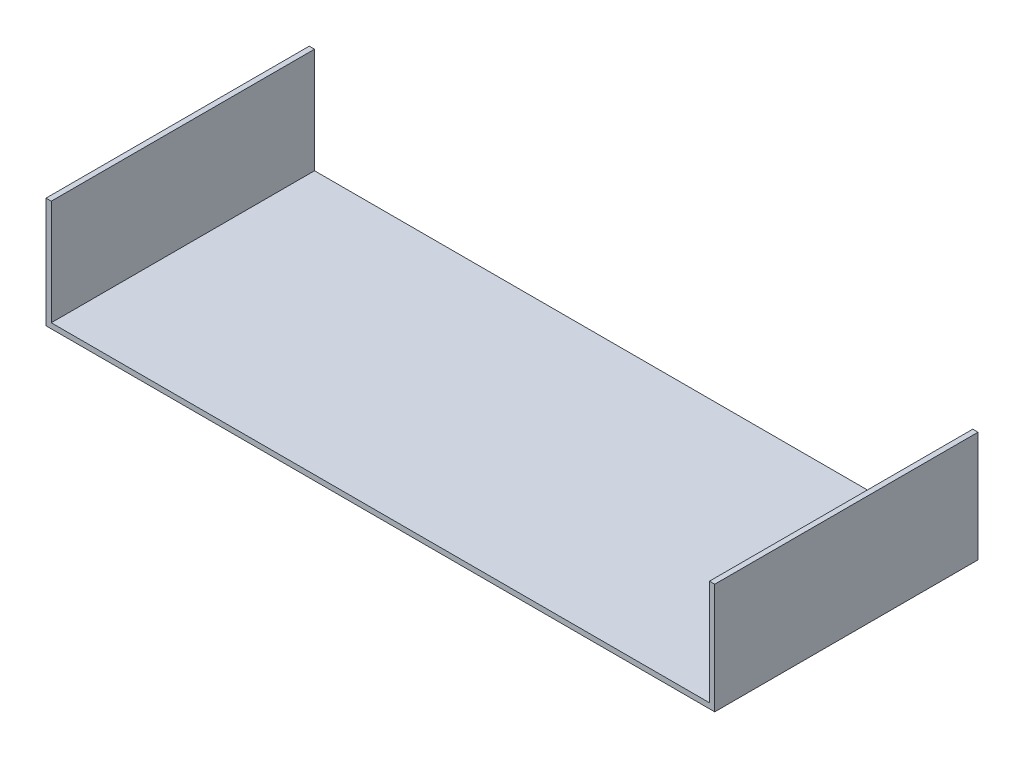
ISO-10303-21;
HEADER;
FILE_DESCRIPTION(('STEP AP214'),'2;1');
FILE_NAME('part.step','',(''),(''),'','','');
FILE_SCHEMA(('AUTOMOTIVE_DESIGN { 1 0 10303 214 1 1 1 1 }'));
ENDSEC;
DATA;
#1=APPLICATION_CONTEXT('core data for automotive mechanical design processes');
#2=APPLICATION_PROTOCOL_DEFINITION('international standard','automotive_design',2000,#1);
#3=PRODUCT_CONTEXT('',#1,'mechanical');
#4=PRODUCT('Part','Part','',(#3));
#5=PRODUCT_RELATED_PRODUCT_CATEGORY('part','',(#4));
#6=PRODUCT_DEFINITION_FORMATION('','',#4);
#7=PRODUCT_DEFINITION_CONTEXT('part definition',#1,'design');
#8=PRODUCT_DEFINITION('design','',#6,#7);
#9=PRODUCT_DEFINITION_SHAPE('','',#8);
#10=(LENGTH_UNIT() NAMED_UNIT(*) SI_UNIT(.MILLI.,.METRE.));
#11=(NAMED_UNIT(*) PLANE_ANGLE_UNIT() SI_UNIT($,.RADIAN.));
#12=(NAMED_UNIT(*) SI_UNIT($,.STERADIAN.) SOLID_ANGLE_UNIT());
#13=UNCERTAINTY_MEASURE_WITH_UNIT(LENGTH_MEASURE(1.E-05),#10,'distance_accuracy_value','');
#14=(GEOMETRIC_REPRESENTATION_CONTEXT(3) GLOBAL_UNCERTAINTY_ASSIGNED_CONTEXT((#13)) GLOBAL_UNIT_ASSIGNED_CONTEXT((#10,
#11,#12)) REPRESENTATION_CONTEXT('',''));
#15=CARTESIAN_POINT('',(0.,0.,0.));
#16=DIRECTION('',(0.,0.,1.));
#17=DIRECTION('',(1.,0.,0.));
#18=AXIS2_PLACEMENT_3D('',#15,#16,#17);
#19=CARTESIAN_POINT('',(-200.,0.,10000.));
#20=DIRECTION('',(0.,-1.,0.));
#21=DIRECTION('',(0.,0.,-1.));
#22=AXIS2_PLACEMENT_3D('',#19,#20,#21);
#23=PLANE('',#22);
#24=DIRECTION('',(-1.,0.,0.));
#25=VECTOR('',#24,1.);
#26=CARTESIAN_POINT('',(-200.,0.,0.));
#27=LINE('',#26,#25);
#28=CARTESIAN_POINT('',(0.,0.,0.));
#29=VERTEX_POINT('',#28);
#30=CARTESIAN_POINT('',(-200.,0.,0.));
#31=VERTEX_POINT('',#30);
#32=EDGE_CURVE('E139',#29,#31,#27,.T.);
#33=ORIENTED_EDGE('',*,*,#32,.T.);
#34=DIRECTION('',(0.,0.,-1.));
#35=VECTOR('',#34,1.);
#36=CARTESIAN_POINT('',(-200.,0.,10000.));
#37=LINE('',#36,#35);
#38=CARTESIAN_POINT('',(-200.,0.,10000.));
#39=VERTEX_POINT('',#38);
#40=EDGE_CURVE('E11',#39,#31,#37,.T.);
#41=ORIENTED_EDGE('',*,*,#40,.F.);
#42=DIRECTION('',(-1.,0.,0.));
#43=VECTOR('',#42,1.);
#44=CARTESIAN_POINT('',(-200.,0.,10000.));
#45=LINE('',#44,#43);
#46=CARTESIAN_POINT('',(0.,0.,10000.));
#47=VERTEX_POINT('',#46);
#48=EDGE_CURVE('E153',#47,#39,#45,.T.);
#49=ORIENTED_EDGE('',*,*,#48,.F.);
#50=DIRECTION('',(0.,0.,-1.));
#51=VECTOR('',#50,1.);
#52=CARTESIAN_POINT('',(0.,0.,10000.));
#53=LINE('',#52,#51);
#54=EDGE_CURVE('E135',#47,#29,#53,.T.);
#55=ORIENTED_EDGE('',*,*,#54,.T.);
#56=EDGE_LOOP('',(#33,#41,#49,#55));
#57=FACE_BOUND('',#56,.T.);
#58=ADVANCED_FACE('F43',(#57),#23,.F.);
#59=CARTESIAN_POINT('',(-200.,0.,10000.));
#60=DIRECTION('',(1.,0.,0.));
#61=DIRECTION('',(0.,1.,0.));
#62=AXIS2_PLACEMENT_3D('',#59,#60,#61);
#63=PLANE('',#62);
#64=DIRECTION('',(0.,-1.,0.));
#65=VECTOR('',#64,1.);
#66=CARTESIAN_POINT('',(-200.,0.,0.));
#67=LINE('',#66,#65);
#68=CARTESIAN_POINT('',(-200.000000000002,-4200.,0.));
#69=VERTEX_POINT('',#68);
#70=EDGE_CURVE('E142',#31,#69,#67,.T.);
#71=ORIENTED_EDGE('',*,*,#70,.T.);
#72=DIRECTION('',(0.,0.,-1.));
#73=VECTOR('',#72,1.);
#74=CARTESIAN_POINT('',(-200.000000000002,-4200.,10000.));
#75=LINE('',#74,#73);
#76=CARTESIAN_POINT('',(-200.000000000002,-4200.,10000.));
#77=VERTEX_POINT('',#76);
#78=EDGE_CURVE('E51',#77,#69,#75,.T.);
#79=ORIENTED_EDGE('',*,*,#78,.F.);
#80=DIRECTION('',(0.,-1.,0.));
#81=VECTOR('',#80,1.);
#82=CARTESIAN_POINT('',(-200.,0.,10000.));
#83=LINE('',#82,#81);
#84=EDGE_CURVE('E102',#39,#77,#83,.T.);
#85=ORIENTED_EDGE('',*,*,#84,.F.);
#86=ORIENTED_EDGE('',*,*,#40,.T.);
#87=EDGE_LOOP('',(#71,#79,#85,#86));
#88=FACE_BOUND('',#87,.T.);
#89=ADVANCED_FACE('F188',(#88),#63,.F.);
#90=CARTESIAN_POINT('',(-200.000000000002,-4200.,10000.));
#91=DIRECTION('',(0.,1.,0.));
#92=DIRECTION('',(0.,0.,1.));
#93=AXIS2_PLACEMENT_3D('',#90,#91,#92);
#94=PLANE('',#93);
#95=DIRECTION('',(1.,0.,0.));
#96=VECTOR('',#95,1.);
#97=CARTESIAN_POINT('',(-200.000000000002,-4200.,0.));
#98=LINE('',#97,#96);
#99=CARTESIAN_POINT('',(25200.,-4200.,0.));
#100=VERTEX_POINT('',#99);
#101=EDGE_CURVE('E144',#69,#100,#98,.T.);
#102=ORIENTED_EDGE('',*,*,#101,.T.);
#103=DIRECTION('',(0.,0.,-1.));
#104=VECTOR('',#103,1.);
#105=CARTESIAN_POINT('',(25200.,-4200.,10000.));
#106=LINE('',#105,#104);
#107=CARTESIAN_POINT('',(25200.,-4200.,10000.));
#108=VERTEX_POINT('',#107);
#109=EDGE_CURVE('E160',#108,#100,#106,.T.);
#110=ORIENTED_EDGE('',*,*,#109,.F.);
#111=DIRECTION('',(1.,0.,0.));
#112=VECTOR('',#111,1.);
#113=CARTESIAN_POINT('',(-200.000000000002,-4200.,10000.));
#114=LINE('',#113,#112);
#115=EDGE_CURVE('E168',#77,#108,#114,.T.);
#116=ORIENTED_EDGE('',*,*,#115,.F.);
#117=ORIENTED_EDGE('',*,*,#78,.T.);
#118=EDGE_LOOP('',(#102,#110,#116,#117));
#119=FACE_BOUND('',#118,.T.);
#120=ADVANCED_FACE('F166',(#119),#94,.F.);
#121=CARTESIAN_POINT('',(25200.,-4200.,10000.));
#122=DIRECTION('',(-1.,0.,0.));
#123=DIRECTION('',(0.,0.,1.));
#124=AXIS2_PLACEMENT_3D('',#121,#122,#123);
#125=PLANE('',#124);
#126=DIRECTION('',(0.,1.,0.));
#127=VECTOR('',#126,1.);
#128=CARTESIAN_POINT('',(25200.,-4200.,0.));
#129=LINE('',#128,#127);
#130=CARTESIAN_POINT('',(25200.,0.,0.));
#131=VERTEX_POINT('',#130);
#132=EDGE_CURVE('E146',#100,#131,#129,.T.);
#133=ORIENTED_EDGE('',*,*,#132,.T.);
#134=DIRECTION('',(0.,0.,-1.));
#135=VECTOR('',#134,1.);
#136=CARTESIAN_POINT('',(25200.,0.,10000.));
#137=LINE('',#136,#135);
#138=CARTESIAN_POINT('',(25200.,0.,10000.));
#139=VERTEX_POINT('',#138);
#140=EDGE_CURVE('E157',#139,#131,#137,.T.);
#141=ORIENTED_EDGE('',*,*,#140,.F.);
#142=DIRECTION('',(0.,1.,0.));
#143=VECTOR('',#142,1.);
#144=CARTESIAN_POINT('',(25200.,-4200.,10000.));
#145=LINE('',#144,#143);
#146=EDGE_CURVE('E180',#108,#139,#145,.T.);
#147=ORIENTED_EDGE('',*,*,#146,.F.);
#148=ORIENTED_EDGE('',*,*,#109,.T.);
#149=EDGE_LOOP('',(#133,#141,#147,#148));
#150=FACE_BOUND('',#149,.T.);
#151=ADVANCED_FACE('F176',(#150),#125,.F.);
#152=CARTESIAN_POINT('',(25000.,0.,10000.));
#153=DIRECTION('',(0.,-1.,0.));
#154=DIRECTION('',(0.,0.,-1.));
#155=AXIS2_PLACEMENT_3D('',#152,#153,#154);
#156=PLANE('',#155);
#157=DIRECTION('',(-1.,0.,0.));
#158=VECTOR('',#157,1.);
#159=CARTESIAN_POINT('',(25000.,0.,0.));
#160=LINE('',#159,#158);
#161=CARTESIAN_POINT('',(25000.,0.,0.));
#162=VERTEX_POINT('',#161);
#163=EDGE_CURVE('E148',#131,#162,#160,.T.);
#164=ORIENTED_EDGE('',*,*,#163,.T.);
#165=DIRECTION('',(0.,0.,-1.));
#166=VECTOR('',#165,1.);
#167=CARTESIAN_POINT('',(25000.,0.,10000.));
#168=LINE('',#167,#166);
#169=CARTESIAN_POINT('',(25000.,0.,10000.));
#170=VERTEX_POINT('',#169);
#171=EDGE_CURVE('E130',#170,#162,#168,.T.);
#172=ORIENTED_EDGE('',*,*,#171,.F.);
#173=DIRECTION('',(-1.,0.,0.));
#174=VECTOR('',#173,1.);
#175=CARTESIAN_POINT('',(25000.,0.,10000.));
#176=LINE('',#175,#174);
#177=EDGE_CURVE('E121',#139,#170,#176,.T.);
#178=ORIENTED_EDGE('',*,*,#177,.F.);
#179=ORIENTED_EDGE('',*,*,#140,.T.);
#180=EDGE_LOOP('',(#164,#172,#178,#179));
#181=FACE_BOUND('',#180,.T.);
#182=ADVANCED_FACE('F179',(#181),#156,.F.);
#183=CARTESIAN_POINT('',(25000.,-4000.,10000.));
#184=DIRECTION('',(1.,0.,0.));
#185=DIRECTION('',(0.,0.,-1.));
#186=AXIS2_PLACEMENT_3D('',#183,#184,#185);
#187=PLANE('',#186);
#188=DIRECTION('',(0.,-1.,0.));
#189=VECTOR('',#188,1.);
#190=CARTESIAN_POINT('',(25000.,-4000.,0.));
#191=LINE('',#190,#189);
#192=CARTESIAN_POINT('',(25000.,-4000.,0.));
#193=VERTEX_POINT('',#192);
#194=EDGE_CURVE('E129',#162,#193,#191,.T.);
#195=ORIENTED_EDGE('',*,*,#194,.T.);
#196=DIRECTION('',(0.,0.,-1.));
#197=VECTOR('',#196,1.);
#198=CARTESIAN_POINT('',(25000.,-4000.,10000.));
#199=LINE('',#198,#197);
#200=CARTESIAN_POINT('',(25000.,-4000.,10000.));
#201=VERTEX_POINT('',#200);
#202=EDGE_CURVE('E126',#201,#193,#199,.T.);
#203=ORIENTED_EDGE('',*,*,#202,.F.);
#204=DIRECTION('',(0.,-1.,0.));
#205=VECTOR('',#204,1.);
#206=CARTESIAN_POINT('',(25000.,-4000.,10000.));
#207=LINE('',#206,#205);
#208=EDGE_CURVE('E115',#170,#201,#207,.T.);
#209=ORIENTED_EDGE('',*,*,#208,.F.);
#210=ORIENTED_EDGE('',*,*,#171,.T.);
#211=EDGE_LOOP('',(#195,#203,#209,#210));
#212=FACE_BOUND('',#211,.T.);
#213=ADVANCED_FACE('F127',(#212),#187,.F.);
#214=CARTESIAN_POINT('',(4.89858719658941E-13,-4000.,10000.));
#215=DIRECTION('',(0.,-1.,0.));
#216=DIRECTION('',(0.,0.,-1.));
#217=AXIS2_PLACEMENT_3D('',#214,#215,#216);
#218=PLANE('',#217);
#219=DIRECTION('',(-1.,0.,0.));
#220=VECTOR('',#219,1.);
#221=CARTESIAN_POINT('',(4.89858719658941E-13,-4000.,0.));
#222=LINE('',#221,#220);
#223=CARTESIAN_POINT('',(4.89858719658941E-13,-4000.,0.));
#224=VERTEX_POINT('',#223);
#225=EDGE_CURVE('E88',#193,#224,#222,.T.);
#226=ORIENTED_EDGE('',*,*,#225,.T.);
#227=DIRECTION('',(0.,0.,-1.));
#228=VECTOR('',#227,1.);
#229=CARTESIAN_POINT('',(4.89858719658941E-13,-4000.,10000.));
#230=LINE('',#229,#228);
#231=CARTESIAN_POINT('',(4.89858719658941E-13,-4000.,10000.));
#232=VERTEX_POINT('',#231);
#233=EDGE_CURVE('E131',#232,#224,#230,.T.);
#234=ORIENTED_EDGE('',*,*,#233,.F.);
#235=DIRECTION('',(-1.,0.,0.));
#236=VECTOR('',#235,1.);
#237=CARTESIAN_POINT('',(4.89858719658941E-13,-4000.,10000.));
#238=LINE('',#237,#236);
#239=EDGE_CURVE('E119',#201,#232,#238,.T.);
#240=ORIENTED_EDGE('',*,*,#239,.F.);
#241=ORIENTED_EDGE('',*,*,#202,.T.);
#242=EDGE_LOOP('',(#226,#234,#240,#241));
#243=FACE_BOUND('',#242,.T.);
#244=ADVANCED_FACE('F133',(#243),#218,.F.);
#245=CARTESIAN_POINT('',(0.,0.,10000.));
#246=DIRECTION('',(-1.,0.,0.));
#247=DIRECTION('',(0.,-1.,0.));
#248=AXIS2_PLACEMENT_3D('',#245,#246,#247);
#249=PLANE('',#248);
#250=DIRECTION('',(0.,1.,0.));
#251=VECTOR('',#250,1.);
#252=CARTESIAN_POINT('',(0.,0.,0.));
#253=LINE('',#252,#251);
#254=EDGE_CURVE('E94',#224,#29,#253,.T.);
#255=ORIENTED_EDGE('',*,*,#254,.T.);
#256=ORIENTED_EDGE('',*,*,#54,.F.);
#257=DIRECTION('',(0.,1.,0.));
#258=VECTOR('',#257,1.);
#259=CARTESIAN_POINT('',(0.,0.,10000.));
#260=LINE('',#259,#258);
#261=EDGE_CURVE('E59',#232,#47,#260,.T.);
#262=ORIENTED_EDGE('',*,*,#261,.F.);
#263=ORIENTED_EDGE('',*,*,#233,.T.);
#264=EDGE_LOOP('',(#255,#256,#262,#263));
#265=FACE_BOUND('',#264,.T.);
#266=ADVANCED_FACE('F204',(#265),#249,.F.);
#267=CARTESIAN_POINT('',(0.,0.,10000.));
#268=DIRECTION('',(0.,0.,-1.));
#269=DIRECTION('',(-1.,0.,0.));
#270=AXIS2_PLACEMENT_3D('',#267,#268,#269);
#271=PLANE('',#270);
#272=ORIENTED_EDGE('',*,*,#48,.T.);
#273=ORIENTED_EDGE('',*,*,#84,.T.);
#274=ORIENTED_EDGE('',*,*,#115,.T.);
#275=ORIENTED_EDGE('',*,*,#146,.T.);
#276=ORIENTED_EDGE('',*,*,#177,.T.);
#277=ORIENTED_EDGE('',*,*,#208,.T.);
#278=ORIENTED_EDGE('',*,*,#239,.T.);
#279=ORIENTED_EDGE('',*,*,#261,.T.);
#280=EDGE_LOOP('',(#272,#273,#274,#275,#276,#277,#278,#279));
#281=FACE_BOUND('',#280,.T.);
#282=ADVANCED_FACE('F117',(#281),#271,.F.);
#283=CARTESIAN_POINT('',(0.,0.,0.));
#284=DIRECTION('',(0.,0.,-1.));
#285=DIRECTION('',(-1.,0.,0.));
#286=AXIS2_PLACEMENT_3D('',#283,#284,#285);
#287=PLANE('',#286);
#288=ORIENTED_EDGE('',*,*,#32,.F.);
#289=ORIENTED_EDGE('',*,*,#254,.F.);
#290=ORIENTED_EDGE('',*,*,#225,.F.);
#291=ORIENTED_EDGE('',*,*,#194,.F.);
#292=ORIENTED_EDGE('',*,*,#163,.F.);
#293=ORIENTED_EDGE('',*,*,#132,.F.);
#294=ORIENTED_EDGE('',*,*,#101,.F.);
#295=ORIENTED_EDGE('',*,*,#70,.F.);
#296=EDGE_LOOP('',(#288,#289,#290,#291,#292,#293,#294,#295));
#297=FACE_BOUND('',#296,.T.);
#298=ADVANCED_FACE('F172',(#297),#287,.T.);
#299=CLOSED_SHELL('',(#58,#89,#120,#151,#182,#213,#244,#266,#282,#298));
#300=MANIFOLD_SOLID_BREP('B2',#299);
#301=ADVANCED_BREP_SHAPE_REPRESENTATION('',(#18,#300),#14);
#302=SHAPE_DEFINITION_REPRESENTATION(#9,#301);
ENDSEC;
END-ISO-10303-21;
